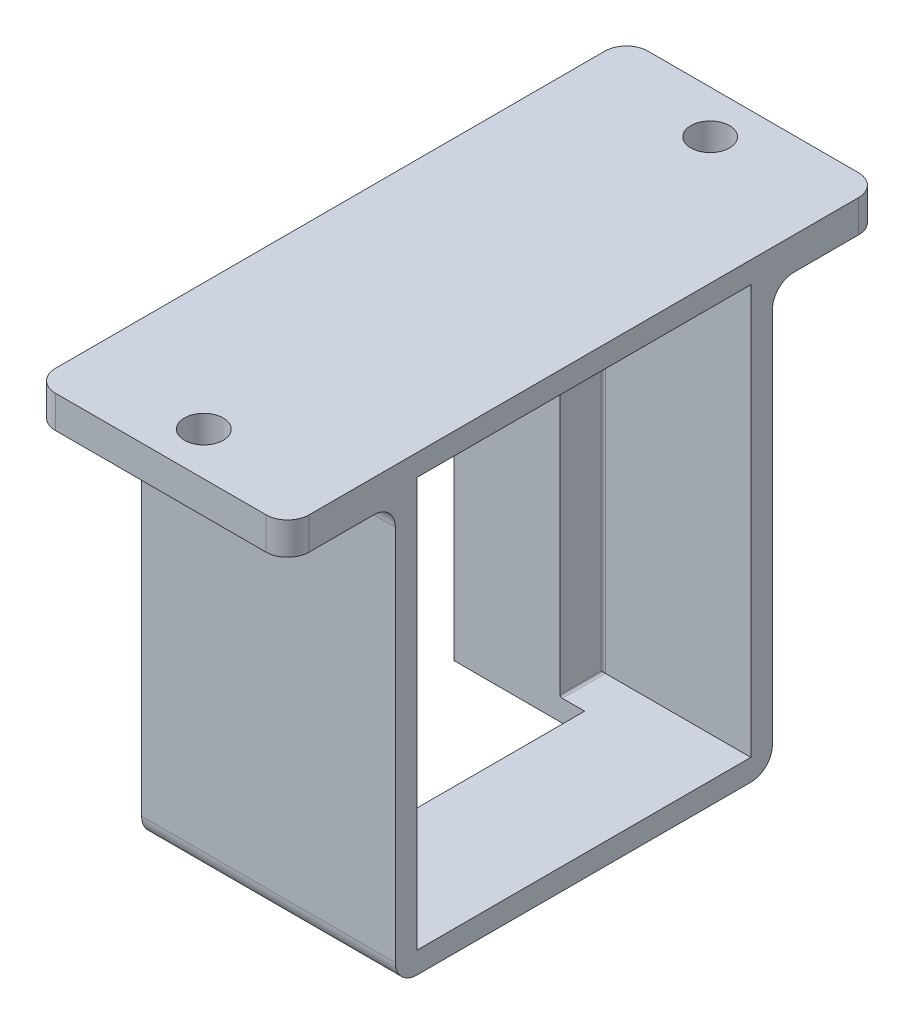
ISO-10303-21;
HEADER;
FILE_DESCRIPTION(('STEP AP214'),'2;1');
FILE_NAME('part.step','',(''),(''),'','','');
FILE_SCHEMA(('AUTOMOTIVE_DESIGN { 1 0 10303 214 1 1 1 1 }'));
ENDSEC;
DATA;
#1=APPLICATION_CONTEXT('core data for automotive mechanical design processes');
#2=APPLICATION_PROTOCOL_DEFINITION('international standard','automotive_design',2000,#1);
#3=PRODUCT_CONTEXT('',#1,'mechanical');
#4=PRODUCT('Part','Part','',(#3));
#5=PRODUCT_RELATED_PRODUCT_CATEGORY('part','',(#4));
#6=PRODUCT_DEFINITION_FORMATION('','',#4);
#7=PRODUCT_DEFINITION_CONTEXT('part definition',#1,'design');
#8=PRODUCT_DEFINITION('design','',#6,#7);
#9=PRODUCT_DEFINITION_SHAPE('','',#8);
#10=(LENGTH_UNIT() NAMED_UNIT(*) SI_UNIT(.MILLI.,.METRE.));
#11=(NAMED_UNIT(*) PLANE_ANGLE_UNIT() SI_UNIT($,.RADIAN.));
#12=(NAMED_UNIT(*) SI_UNIT($,.STERADIAN.) SOLID_ANGLE_UNIT());
#13=UNCERTAINTY_MEASURE_WITH_UNIT(LENGTH_MEASURE(1.E-05),#10,'distance_accuracy_value','');
#14=(GEOMETRIC_REPRESENTATION_CONTEXT(3) GLOBAL_UNCERTAINTY_ASSIGNED_CONTEXT((#13)) GLOBAL_UNIT_ASSIGNED_CONTEXT((#10,
#11,#12)) REPRESENTATION_CONTEXT('',''));
#15=CARTESIAN_POINT('',(0.,0.,0.));
#16=DIRECTION('',(0.,0.,1.));
#17=DIRECTION('',(1.,0.,0.));
#18=AXIS2_PLACEMENT_3D('',#15,#16,#17);
#19=CARTESIAN_POINT('',(106.2,-1.72624809327456,0.));
#20=DIRECTION('',(0.,0.,1.));
#21=DIRECTION('',(1.,0.,0.));
#22=AXIS2_PLACEMENT_3D('',#19,#20,#21);
#23=CYLINDRICAL_SURFACE('',#22,0.2);
#24=DIRECTION('',(0.,0.,-1.));
#25=VECTOR('',#24,1.);
#26=CARTESIAN_POINT('',(106.2,-1.92624809327456,-109.5));
#27=LINE('',#26,#25);
#28=CARTESIAN_POINT('',(106.2,-1.92624809327456,-113.5));
#29=VERTEX_POINT('',#28);
#30=CARTESIAN_POINT('',(106.2,-1.92624809327456,-109.5));
#31=VERTEX_POINT('',#30);
#32=EDGE_CURVE('E371',#29,#31,#27,.F.);
#33=ORIENTED_EDGE('',*,*,#32,.F.);
#34=CARTESIAN_POINT('',(106.2,-1.72624809327456,-113.5));
#35=DIRECTION('',(0.,0.,1.));
#36=DIRECTION('',(0.,-1.,0.));
#37=AXIS2_PLACEMENT_3D('',#34,#35,#36);
#38=CIRCLE('',#37,0.2);
#39=CARTESIAN_POINT('',(106.,-1.72624809327456,-113.5));
#40=VERTEX_POINT('',#39);
#41=EDGE_CURVE('E576',#29,#40,#38,.F.);
#42=ORIENTED_EDGE('',*,*,#41,.T.);
#43=DIRECTION('',(0.,0.,-1.));
#44=VECTOR('',#43,1.);
#45=CARTESIAN_POINT('',(106.,-1.72624809327456,-140.5));
#46=LINE('',#45,#44);
#47=CARTESIAN_POINT('',(106.,-1.72624809327456,-109.7));
#48=VERTEX_POINT('',#47);
#49=EDGE_CURVE('E352',#48,#40,#46,.T.);
#50=ORIENTED_EDGE('',*,*,#49,.F.);
#51=CARTESIAN_POINT('',(106.2,-1.72624809327456,-109.7));
#52=DIRECTION('',(0.,0.707106781186547,0.707106781186548));
#53=DIRECTION('',(0.,-0.707106781186548,0.707106781186547));
#54=AXIS2_PLACEMENT_3D('',#51,#52,#53);
#55=ELLIPSE('',#54,0.282842712474619,0.2);
#56=EDGE_CURVE('E385',#31,#48,#55,.F.);
#57=ORIENTED_EDGE('',*,*,#56,.F.);
#58=EDGE_LOOP('',(#33,#42,#50,#57));
#59=FACE_BOUND('',#58,.T.);
#60=ADVANCED_FACE('F49',(#59),#23,.F.);
#61=CARTESIAN_POINT('',(107.981937187953,38.0737519067254,-111.5));
#62=DIRECTION('',(0.,1.,0.));
#63=DIRECTION('',(-1.,0.,0.));
#64=AXIS2_PLACEMENT_3D('',#61,#62,#63);
#65=PLANE('',#64);
#66=DIRECTION('',(1.,0.,0.));
#67=VECTOR('',#66,1.);
#68=CARTESIAN_POINT('',(96.1491129061229,38.0737519067254,-97.5000000000001));
#69=LINE('',#68,#67);
#70=CARTESIAN_POINT('',(98.1491129061229,38.0737519067254,-97.5000000000001));
#71=VERTEX_POINT('',#70);
#72=CARTESIAN_POINT('',(117.7,38.0737519067254,-97.5000000000001));
#73=VERTEX_POINT('',#72);
#74=EDGE_CURVE('E599',#71,#73,#69,.T.);
#75=ORIENTED_EDGE('',*,*,#74,.T.);
#76=CARTESIAN_POINT('',(117.7,38.0737519067254,-99.5000000000001));
#77=DIRECTION('',(0.,1.,0.));
#78=DIRECTION('',(-1.,0.,0.));
#79=AXIS2_PLACEMENT_3D('',#76,#77,#78);
#80=CIRCLE('',#79,2.);
#81=CARTESIAN_POINT('',(119.7,38.0737519067254,-99.5000000000001));
#82=VERTEX_POINT('',#81);
#83=EDGE_CURVE('E508',#73,#82,#80,.T.);
#84=ORIENTED_EDGE('',*,*,#83,.T.);
#85=DIRECTION('',(0.,0.,1.));
#86=VECTOR('',#85,1.);
#87=CARTESIAN_POINT('',(119.7,38.0737519067254,-113.5));
#88=LINE('',#87,#86);
#89=CARTESIAN_POINT('',(119.7,38.0737519067254,-150.5));
#90=VERTEX_POINT('',#89);
#91=EDGE_CURVE('E334',#90,#82,#88,.T.);
#92=ORIENTED_EDGE('',*,*,#91,.F.);
#93=CARTESIAN_POINT('',(117.7,38.0737519067254,-150.5));
#94=DIRECTION('',(0.,1.,0.));
#95=DIRECTION('',(-1.,0.,0.));
#96=AXIS2_PLACEMENT_3D('',#93,#94,#95);
#97=CIRCLE('',#96,2.);
#98=CARTESIAN_POINT('',(117.7,38.0737519067254,-152.5));
#99=VERTEX_POINT('',#98);
#100=EDGE_CURVE('E71',#90,#99,#97,.T.);
#101=ORIENTED_EDGE('',*,*,#100,.T.);
#102=DIRECTION('',(1.,0.,0.));
#103=VECTOR('',#102,1.);
#104=CARTESIAN_POINT('',(96.1491129061229,38.0737519067254,-152.5));
#105=LINE('',#104,#103);
#106=CARTESIAN_POINT('',(98.1491129061229,38.0737519067254,-152.5));
#107=VERTEX_POINT('',#106);
#108=EDGE_CURVE('E515',#107,#99,#105,.T.);
#109=ORIENTED_EDGE('',*,*,#108,.F.);
#110=CARTESIAN_POINT('',(98.1491129061229,38.0737519067254,-150.5));
#111=DIRECTION('',(0.,1.,0.));
#112=DIRECTION('',(-1.,0.,0.));
#113=AXIS2_PLACEMENT_3D('',#110,#111,#112);
#114=CIRCLE('',#113,2.);
#115=CARTESIAN_POINT('',(96.1491129061229,38.0737519067254,-150.5));
#116=VERTEX_POINT('',#115);
#117=EDGE_CURVE('E472',#107,#116,#114,.T.);
#118=ORIENTED_EDGE('',*,*,#117,.T.);
#119=DIRECTION('',(0.,0.,1.));
#120=VECTOR('',#119,1.);
#121=CARTESIAN_POINT('',(96.1491129061229,38.0737519067254,-101.));
#122=LINE('',#121,#120);
#123=CARTESIAN_POINT('',(96.1491129061229,38.0737519067254,-99.5000000000001));
#124=VERTEX_POINT('',#123);
#125=EDGE_CURVE('E289',#116,#124,#122,.T.);
#126=ORIENTED_EDGE('',*,*,#125,.T.);
#127=CARTESIAN_POINT('',(98.1491129061229,38.0737519067254,-99.5000000000001));
#128=DIRECTION('',(0.,1.,0.));
#129=DIRECTION('',(-1.,0.,0.));
#130=AXIS2_PLACEMENT_3D('',#127,#128,#129);
#131=CIRCLE('',#130,2.);
#132=EDGE_CURVE('E469',#124,#71,#131,.T.);
#133=ORIENTED_EDGE('',*,*,#132,.T.);
#134=EDGE_LOOP('',(#75,#84,#92,#101,#109,#118,#126,#133));
#135=FACE_BOUND('',#134,.T.);
#136=CARTESIAN_POINT('',(107.924556453061,38.0737519067254,-101.5));
#137=DIRECTION('',(0.,1.,0.));
#138=DIRECTION('',(-1.,0.,0.));
#139=AXIS2_PLACEMENT_3D('',#136,#137,#138);
#140=CIRCLE('',#139,1.79999999999999);
#141=CARTESIAN_POINT('',(106.124556453061,38.0737519067254,-101.5));
#142=VERTEX_POINT('',#141);
#143=EDGE_CURVE('E585',#142,#142,#140,.T.);
#144=ORIENTED_EDGE('',*,*,#143,.F.);
#145=EDGE_LOOP('',(#144));
#146=FACE_BOUND('',#145,.T.);
#147=CARTESIAN_POINT('',(107.924556453061,38.0737519067254,-148.5));
#148=DIRECTION('',(0.,1.,0.));
#149=DIRECTION('',(-1.,0.,0.));
#150=AXIS2_PLACEMENT_3D('',#147,#148,#149);
#151=CIRCLE('',#150,1.79999999999999);
#152=CARTESIAN_POINT('',(106.124556453061,38.0737519067254,-148.5));
#153=VERTEX_POINT('',#152);
#154=EDGE_CURVE('E592',#153,#153,#151,.F.);
#155=ORIENTED_EDGE('',*,*,#154,.T.);
#156=EDGE_LOOP('',(#155));
#157=FACE_BOUND('',#156,.T.);
#158=ADVANCED_FACE('F626',(#135,#146,#157),#65,.T.);
#159=CARTESIAN_POINT('',(107.981937187953,34.0737519067254,-142.5));
#160=DIRECTION('',(0.,0.,-1.));
#161=DIRECTION('',(0.,1.,0.));
#162=AXIS2_PLACEMENT_3D('',#159,#160,#161);
#163=PLANE('',#162);
#164=DIRECTION('',(0.,1.,0.));
#165=VECTOR('',#164,1.);
#166=CARTESIAN_POINT('',(96.1491129061229,42.2892933169066,-142.5));
#167=LINE('',#166,#165);
#168=CARTESIAN_POINT('',(96.1491129061228,-1.92624809327456,-142.5));
#169=VERTEX_POINT('',#168);
#170=CARTESIAN_POINT('',(96.1491129061228,33.0737519067254,-142.5));
#171=VERTEX_POINT('',#170);
#172=EDGE_CURVE('E293',#169,#171,#167,.T.);
#173=ORIENTED_EDGE('',*,*,#172,.T.);
#174=DIRECTION('',(-1.,0.,0.));
#175=VECTOR('',#174,1.);
#176=CARTESIAN_POINT('',(107.981937187953,33.0737519067254,-142.5));
#177=LINE('',#176,#175);
#178=CARTESIAN_POINT('',(119.7,33.0737519067254,-142.5));
#179=VERTEX_POINT('',#178);
#180=EDGE_CURVE('E438',#171,#179,#177,.F.);
#181=ORIENTED_EDGE('',*,*,#180,.T.);
#182=DIRECTION('',(0.,1.,0.));
#183=VECTOR('',#182,1.);
#184=CARTESIAN_POINT('',(119.7,32.0737519067254,-142.5));
#185=LINE('',#184,#183);
#186=CARTESIAN_POINT('',(119.7,-1.92624809327456,-142.5));
#187=VERTEX_POINT('',#186);
#188=EDGE_CURVE('E330',#187,#179,#185,.T.);
#189=ORIENTED_EDGE('',*,*,#188,.F.);
#190=DIRECTION('',(1.,0.,0.));
#191=VECTOR('',#190,1.);
#192=CARTESIAN_POINT('',(96.1491129061228,-1.92624809327456,-142.5));
#193=LINE('',#192,#191);
#194=EDGE_CURVE('E413',#187,#169,#193,.F.);
#195=ORIENTED_EDGE('',*,*,#194,.T.);
#196=EDGE_LOOP('',(#173,#181,#189,#195));
#197=FACE_BOUND('',#196,.T.);
#198=ADVANCED_FACE('F542',(#197),#163,.T.);
#199=CARTESIAN_POINT('',(119.7,34.0737519067254,-107.5));
#200=DIRECTION('',(0.,0.,1.));
#201=DIRECTION('',(0.,-1.,0.));
#202=AXIS2_PLACEMENT_3D('',#199,#200,#201);
#203=PLANE('',#202);
#204=DIRECTION('',(0.,-1.,0.));
#205=VECTOR('',#204,1.);
#206=CARTESIAN_POINT('',(119.7,32.0737519067254,-107.5));
#207=LINE('',#206,#205);
#208=CARTESIAN_POINT('',(119.7,33.0737519067254,-107.5));
#209=VERTEX_POINT('',#208);
#210=CARTESIAN_POINT('',(119.7,-1.92624809327457,-107.5));
#211=VERTEX_POINT('',#210);
#212=EDGE_CURVE('E327',#209,#211,#207,.T.);
#213=ORIENTED_EDGE('',*,*,#212,.F.);
#214=DIRECTION('',(-1.,0.,0.));
#215=VECTOR('',#214,1.);
#216=CARTESIAN_POINT('',(96.1491129061229,33.0737519067254,-107.5));
#217=LINE('',#216,#215);
#218=CARTESIAN_POINT('',(96.1491129061228,33.0737519067254,-107.5));
#219=VERTEX_POINT('',#218);
#220=EDGE_CURVE('E426',#209,#219,#217,.T.);
#221=ORIENTED_EDGE('',*,*,#220,.T.);
#222=DIRECTION('',(0.,-1.,0.));
#223=VECTOR('',#222,1.);
#224=CARTESIAN_POINT('',(96.1491129061229,42.2892933169067,-107.5));
#225=LINE('',#224,#223);
#226=CARTESIAN_POINT('',(96.1491129061228,-1.92624809327457,-107.5));
#227=VERTEX_POINT('',#226);
#228=EDGE_CURVE('E395',#219,#227,#225,.T.);
#229=ORIENTED_EDGE('',*,*,#228,.T.);
#230=DIRECTION('',(1.,0.,0.));
#231=VECTOR('',#230,1.);
#232=CARTESIAN_POINT('',(119.7,-1.92624809327457,-107.5));
#233=LINE('',#232,#231);
#234=EDGE_CURVE('E422',#227,#211,#233,.T.);
#235=ORIENTED_EDGE('',*,*,#234,.T.);
#236=EDGE_LOOP('',(#213,#221,#229,#235));
#237=FACE_BOUND('',#236,.T.);
#238=ADVANCED_FACE('F555',(#237),#203,.T.);
#239=CARTESIAN_POINT('',(105.64252224468,-3.92624809327456,-145.738640408124));
#240=DIRECTION('',(0.,1.,0.));
#241=DIRECTION('',(0.,0.,1.));
#242=AXIS2_PLACEMENT_3D('',#239,#240,#241);
#243=PLANE('',#242);
#244=DIRECTION('',(0.,0.,1.));
#245=VECTOR('',#244,1.);
#246=CARTESIAN_POINT('',(96.1491129061229,-3.92624809327456,-107.500000000016));
#247=LINE('',#246,#245);
#248=CARTESIAN_POINT('',(96.1491129061229,-3.92624809327456,-113.5));
#249=VERTEX_POINT('',#248);
#250=CARTESIAN_POINT('',(96.1491129061229,-3.92624809327456,-109.5));
#251=VERTEX_POINT('',#250);
#252=EDGE_CURVE('E276',#249,#251,#247,.T.);
#253=ORIENTED_EDGE('',*,*,#252,.F.);
#254=DIRECTION('',(-1.,0.,0.));
#255=VECTOR('',#254,1.);
#256=CARTESIAN_POINT('',(96.1491129061229,-3.92624809327456,-113.5));
#257=LINE('',#256,#255);
#258=CARTESIAN_POINT('',(108.273016103018,-3.92624809327456,-113.5));
#259=VERTEX_POINT('',#258);
#260=EDGE_CURVE('E559',#259,#249,#257,.T.);
#261=ORIENTED_EDGE('',*,*,#260,.F.);
#262=DIRECTION('',(0.,0.,1.));
#263=VECTOR('',#262,1.);
#264=CARTESIAN_POINT('',(108.273016103018,-3.92624809327456,-136.5));
#265=LINE('',#264,#263);
#266=CARTESIAN_POINT('',(108.273016103018,-3.92624809327456,-136.5));
#267=VERTEX_POINT('',#266);
#268=EDGE_CURVE('E266',#267,#259,#265,.T.);
#269=ORIENTED_EDGE('',*,*,#268,.F.);
#270=DIRECTION('',(1.,0.,0.));
#271=VECTOR('',#270,1.);
#272=CARTESIAN_POINT('',(96.1491129061229,-3.92624809327456,-136.5));
#273=LINE('',#272,#271);
#274=CARTESIAN_POINT('',(96.1491129061229,-3.92624809327456,-136.5));
#275=VERTEX_POINT('',#274);
#276=EDGE_CURVE('E245',#275,#267,#273,.T.);
#277=ORIENTED_EDGE('',*,*,#276,.F.);
#278=CARTESIAN_POINT('',(96.1491129061229,-3.92624809327456,-140.5));
#279=VERTEX_POINT('',#278);
#280=EDGE_CURVE('E262',#279,#275,#247,.T.);
#281=ORIENTED_EDGE('',*,*,#280,.F.);
#282=DIRECTION('',(1.,0.,0.));
#283=VECTOR('',#282,1.);
#284=CARTESIAN_POINT('',(119.7,-3.92624809327456,-140.5));
#285=LINE('',#284,#283);
#286=CARTESIAN_POINT('',(119.7,-3.92624809327456,-140.5));
#287=VERTEX_POINT('',#286);
#288=EDGE_CURVE('E404',#279,#287,#285,.T.);
#289=ORIENTED_EDGE('',*,*,#288,.T.);
#290=DIRECTION('',(0.,0.,-1.));
#291=VECTOR('',#290,1.);
#292=CARTESIAN_POINT('',(119.7,-3.92624809327456,-107.5));
#293=LINE('',#292,#291);
#294=CARTESIAN_POINT('',(119.7,-3.92624809327456,-109.5));
#295=VERTEX_POINT('',#294);
#296=EDGE_CURVE('E275',#295,#287,#293,.T.);
#297=ORIENTED_EDGE('',*,*,#296,.F.);
#298=DIRECTION('',(1.,0.,0.));
#299=VECTOR('',#298,1.);
#300=CARTESIAN_POINT('',(96.1491129061228,-3.92624809327456,-109.5));
#301=LINE('',#300,#299);
#302=EDGE_CURVE('E379',#295,#251,#301,.F.);
#303=ORIENTED_EDGE('',*,*,#302,.T.);
#304=EDGE_LOOP('',(#253,#261,#269,#277,#281,#289,#297,#303));
#305=FACE_BOUND('',#304,.T.);
#306=ADVANCED_FACE('F260',(#305),#243,.F.);
#307=CARTESIAN_POINT('',(106.,0.,0.));
#308=DIRECTION('',(1.,0.,0.));
#309=DIRECTION('',(0.,0.,-1.));
#310=AXIS2_PLACEMENT_3D('',#307,#308,#309);
#311=PLANE('',#310);
#312=ORIENTED_EDGE('',*,*,#49,.T.);
#313=DIRECTION('',(0.,-1.,0.));
#314=VECTOR('',#313,1.);
#315=CARTESIAN_POINT('',(106.,32.0737519067254,-113.5));
#316=LINE('',#315,#314);
#317=CARTESIAN_POINT('',(106.,32.0737519067254,-113.5));
#318=VERTEX_POINT('',#317);
#319=EDGE_CURVE('E301',#318,#40,#316,.T.);
#320=ORIENTED_EDGE('',*,*,#319,.F.);
#321=DIRECTION('',(0.,0.,1.));
#322=VECTOR('',#321,1.);
#323=CARTESIAN_POINT('',(106.,32.0737519067254,-113.5));
#324=LINE('',#323,#322);
#325=CARTESIAN_POINT('',(106.,32.0737519067254,-136.5));
#326=VERTEX_POINT('',#325);
#327=EDGE_CURVE('E308',#326,#318,#324,.T.);
#328=ORIENTED_EDGE('',*,*,#327,.F.);
#329=DIRECTION('',(0.,1.,0.));
#330=VECTOR('',#329,1.);
#331=CARTESIAN_POINT('',(106.,32.0737519067254,-136.5));
#332=LINE('',#331,#330);
#333=CARTESIAN_POINT('',(106.,-1.72624809327456,-136.5));
#334=VERTEX_POINT('',#333);
#335=EDGE_CURVE('E304',#334,#326,#332,.T.);
#336=ORIENTED_EDGE('',*,*,#335,.F.);
#337=CARTESIAN_POINT('',(106.,-1.72624809327456,-140.3));
#338=VERTEX_POINT('',#337);
#339=EDGE_CURVE('E351',#334,#338,#46,.T.);
#340=ORIENTED_EDGE('',*,*,#339,.T.);
#341=DIRECTION('',(0.,1.,0.));
#342=VECTOR('',#341,1.);
#343=CARTESIAN_POINT('',(106.,36.0737519067254,-140.3));
#344=LINE('',#343,#342);
#345=CARTESIAN_POINT('',(106.,35.8737519067254,-140.3));
#346=VERTEX_POINT('',#345);
#347=EDGE_CURVE('E356',#338,#346,#344,.T.);
#348=ORIENTED_EDGE('',*,*,#347,.T.);
#349=DIRECTION('',(0.,0.,1.));
#350=VECTOR('',#349,1.);
#351=CARTESIAN_POINT('',(106.,35.8737519067254,-109.5));
#352=LINE('',#351,#350);
#353=CARTESIAN_POINT('',(106.,35.8737519067254,-109.7));
#354=VERTEX_POINT('',#353);
#355=EDGE_CURVE('E359',#346,#354,#352,.T.);
#356=ORIENTED_EDGE('',*,*,#355,.T.);
#357=DIRECTION('',(0.,-1.,0.));
#358=VECTOR('',#357,1.);
#359=CARTESIAN_POINT('',(106.,-1.92624809327456,-109.7));
#360=LINE('',#359,#358);
#361=EDGE_CURVE('E348',#354,#48,#360,.T.);
#362=ORIENTED_EDGE('',*,*,#361,.T.);
#363=EDGE_LOOP('',(#312,#320,#328,#336,#340,#348,#356,#362));
#364=FACE_BOUND('',#363,.T.);
#365=ADVANCED_FACE('F692',(#364),#311,.T.);
#366=CARTESIAN_POINT('',(85.,32.0737519067254,-113.5));
#367=DIRECTION('',(0.,1.,0.));
#368=DIRECTION('',(-1.,0.,0.));
#369=AXIS2_PLACEMENT_3D('',#366,#367,#368);
#370=PLANE('',#369);
#371=DIRECTION('',(1.,0.,0.));
#372=VECTOR('',#371,1.);
#373=CARTESIAN_POINT('',(85.,32.0737519067254,-136.5));
#374=LINE('',#373,#372);
#375=CARTESIAN_POINT('',(96.1491129061228,32.0737519067254,-136.5));
#376=VERTEX_POINT('',#375);
#377=EDGE_CURVE('E248',#376,#326,#374,.T.);
#378=ORIENTED_EDGE('',*,*,#377,.T.);
#379=ORIENTED_EDGE('',*,*,#327,.T.);
#380=DIRECTION('',(1.,0.,0.));
#381=VECTOR('',#380,1.);
#382=CARTESIAN_POINT('',(85.,32.0737519067254,-113.5));
#383=LINE('',#382,#381);
#384=CARTESIAN_POINT('',(96.1491129061228,32.0737519067254,-113.5));
#385=VERTEX_POINT('',#384);
#386=EDGE_CURVE('E255',#385,#318,#383,.T.);
#387=ORIENTED_EDGE('',*,*,#386,.F.);
#388=DIRECTION('',(0.,0.,1.));
#389=VECTOR('',#388,1.);
#390=CARTESIAN_POINT('',(96.1491129061228,32.0737519067254,-101.));
#391=LINE('',#390,#389);
#392=EDGE_CURVE('E297',#376,#385,#391,.T.);
#393=ORIENTED_EDGE('',*,*,#392,.F.);
#394=EDGE_LOOP('',(#378,#379,#387,#393));
#395=FACE_BOUND('',#394,.T.);
#396=ADVANCED_FACE('F697',(#395),#370,.F.);
#397=CARTESIAN_POINT('',(85.,32.0737519067254,-136.5));
#398=DIRECTION('',(0.,0.,-1.));
#399=DIRECTION('',(0.,1.,0.));
#400=AXIS2_PLACEMENT_3D('',#397,#398,#399);
#401=PLANE('',#400);
#402=DIRECTION('',(0.,1.,0.));
#403=VECTOR('',#402,1.);
#404=CARTESIAN_POINT('',(96.1491129061229,42.2892933169066,-136.5));
#405=LINE('',#404,#403);
#406=EDGE_CURVE('E242',#275,#376,#405,.T.);
#407=ORIENTED_EDGE('',*,*,#406,.F.);
#408=ORIENTED_EDGE('',*,*,#276,.T.);
#409=DIRECTION('',(0.,-1.,0.));
#410=VECTOR('',#409,1.);
#411=CARTESIAN_POINT('',(108.273016103018,2.07375190672545,-136.5));
#412=LINE('',#411,#410);
#413=CARTESIAN_POINT('',(108.273016103018,-1.92624809327456,-136.5));
#414=VERTEX_POINT('',#413);
#415=EDGE_CURVE('E562',#414,#267,#412,.T.);
#416=ORIENTED_EDGE('',*,*,#415,.F.);
#417=DIRECTION('',(-1.,0.,0.));
#418=VECTOR('',#417,1.);
#419=CARTESIAN_POINT('',(144.,-1.92624809327456,-136.5));
#420=LINE('',#419,#418);
#421=CARTESIAN_POINT('',(106.2,-1.92624809327456,-136.5));
#422=VERTEX_POINT('',#421);
#423=EDGE_CURVE('E455',#414,#422,#420,.T.);
#424=ORIENTED_EDGE('',*,*,#423,.T.);
#425=CARTESIAN_POINT('',(106.2,-1.72624809327456,-136.5));
#426=DIRECTION('',(0.,0.,-1.));
#427=DIRECTION('',(0.,1.,0.));
#428=AXIS2_PLACEMENT_3D('',#425,#426,#427);
#429=CIRCLE('',#428,0.2);
#430=EDGE_CURVE('E571',#334,#422,#429,.F.);
#431=ORIENTED_EDGE('',*,*,#430,.F.);
#432=ORIENTED_EDGE('',*,*,#335,.T.);
#433=ORIENTED_EDGE('',*,*,#377,.F.);
#434=EDGE_LOOP('',(#407,#408,#416,#424,#431,#432,#433));
#435=FACE_BOUND('',#434,.T.);
#436=ADVANCED_FACE('F244',(#435),#401,.F.);
#437=CARTESIAN_POINT('',(85.,32.0737519067254,-113.5));
#438=DIRECTION('',(0.,0.,1.));
#439=DIRECTION('',(0.,-1.,0.));
#440=AXIS2_PLACEMENT_3D('',#437,#438,#439);
#441=PLANE('',#440);
#442=ORIENTED_EDGE('',*,*,#319,.T.);
#443=ORIENTED_EDGE('',*,*,#41,.F.);
#444=DIRECTION('',(1.,0.,0.));
#445=VECTOR('',#444,1.);
#446=CARTESIAN_POINT('',(144.,-1.92624809327456,-113.5));
#447=LINE('',#446,#445);
#448=CARTESIAN_POINT('',(108.273016103018,-1.92624809327456,-113.5));
#449=VERTEX_POINT('',#448);
#450=EDGE_CURVE('E462',#29,#449,#447,.T.);
#451=ORIENTED_EDGE('',*,*,#450,.T.);
#452=DIRECTION('',(0.,-1.,0.));
#453=VECTOR('',#452,1.);
#454=CARTESIAN_POINT('',(108.273016103018,2.07375190672544,-113.5));
#455=LINE('',#454,#453);
#456=EDGE_CURVE('E566',#449,#259,#455,.T.);
#457=ORIENTED_EDGE('',*,*,#456,.T.);
#458=ORIENTED_EDGE('',*,*,#260,.T.);
#459=DIRECTION('',(0.,-1.,0.));
#460=VECTOR('',#459,1.);
#461=CARTESIAN_POINT('',(96.1491129061229,42.2892933169067,-113.5));
#462=LINE('',#461,#460);
#463=EDGE_CURVE('E254',#385,#249,#462,.T.);
#464=ORIENTED_EDGE('',*,*,#463,.F.);
#465=ORIENTED_EDGE('',*,*,#386,.T.);
#466=EDGE_LOOP('',(#442,#443,#451,#457,#458,#464,#465));
#467=FACE_BOUND('',#466,.T.);
#468=ADVANCED_FACE('F698',(#467),#441,.F.);
#469=CARTESIAN_POINT('',(96.1491129061229,42.2892933169067,-101.));
#470=DIRECTION('',(1.,0.,0.));
#471=DIRECTION('',(0.,1.,0.));
#472=AXIS2_PLACEMENT_3D('',#469,#470,#471);
#473=PLANE('',#472);
#474=ORIENTED_EDGE('',*,*,#125,.F.);
#475=DIRECTION('',(0.,1.,0.));
#476=VECTOR('',#475,1.);
#477=CARTESIAN_POINT('',(96.1491129061229,42.2892933169067,-150.5));
#478=LINE('',#477,#476);
#479=CARTESIAN_POINT('',(96.1491129061229,35.0737519067254,-150.5));
#480=VERTEX_POINT('',#479);
#481=EDGE_CURVE('E479',#116,#480,#478,.F.);
#482=ORIENTED_EDGE('',*,*,#481,.T.);
#483=DIRECTION('',(0.,0.,1.));
#484=VECTOR('',#483,1.);
#485=CARTESIAN_POINT('',(96.1491129061229,35.0737519067254,-152.5));
#486=LINE('',#485,#484);
#487=CARTESIAN_POINT('',(96.1491129061229,35.0737519067254,-144.5));
#488=VERTEX_POINT('',#487);
#489=EDGE_CURVE('E523',#480,#488,#486,.T.);
#490=ORIENTED_EDGE('',*,*,#489,.T.);
#491=CARTESIAN_POINT('',(96.1491129061228,33.0737519067254,-144.5));
#492=DIRECTION('',(1.,0.,0.));
#493=DIRECTION('',(0.,1.,0.));
#494=AXIS2_PLACEMENT_3D('',#491,#492,#493);
#495=CIRCLE('',#494,2.);
#496=EDGE_CURVE('E448',#488,#171,#495,.T.);
#497=ORIENTED_EDGE('',*,*,#496,.T.);
#498=ORIENTED_EDGE('',*,*,#172,.F.);
#499=CARTESIAN_POINT('',(96.1491129061228,-1.92624809327456,-140.5));
#500=DIRECTION('',(1.,0.,0.));
#501=DIRECTION('',(0.,1.,0.));
#502=AXIS2_PLACEMENT_3D('',#499,#500,#501);
#503=CIRCLE('',#502,2.);
#504=EDGE_CURVE('E273',#169,#279,#503,.F.);
#505=ORIENTED_EDGE('',*,*,#504,.T.);
#506=ORIENTED_EDGE('',*,*,#280,.T.);
#507=ORIENTED_EDGE('',*,*,#406,.T.);
#508=ORIENTED_EDGE('',*,*,#392,.T.);
#509=ORIENTED_EDGE('',*,*,#463,.T.);
#510=ORIENTED_EDGE('',*,*,#252,.T.);
#511=CARTESIAN_POINT('',(96.1491129061228,-1.92624809327457,-109.5));
#512=DIRECTION('',(1.,0.,0.));
#513=DIRECTION('',(0.,1.,0.));
#514=AXIS2_PLACEMENT_3D('',#511,#512,#513);
#515=CIRCLE('',#514,2.);
#516=EDGE_CURVE('E416',#251,#227,#515,.F.);
#517=ORIENTED_EDGE('',*,*,#516,.T.);
#518=ORIENTED_EDGE('',*,*,#228,.F.);
#519=CARTESIAN_POINT('',(96.1491129061229,33.0737519067254,-105.5));
#520=DIRECTION('',(1.,0.,0.));
#521=DIRECTION('',(0.,1.,0.));
#522=AXIS2_PLACEMENT_3D('',#519,#520,#521);
#523=CIRCLE('',#522,2.);
#524=CARTESIAN_POINT('',(96.1491129061229,35.0737519067255,-105.5));
#525=VERTEX_POINT('',#524);
#526=EDGE_CURVE('E441',#219,#525,#523,.T.);
#527=ORIENTED_EDGE('',*,*,#526,.T.);
#528=DIRECTION('',(0.,0.,-1.));
#529=VECTOR('',#528,1.);
#530=CARTESIAN_POINT('',(96.1491129061229,35.0737519067254,-97.5000000000001));
#531=LINE('',#530,#529);
#532=CARTESIAN_POINT('',(96.1491129061229,35.0737519067254,-99.5000000000001));
#533=VERTEX_POINT('',#532);
#534=EDGE_CURVE('E528',#533,#525,#531,.T.);
#535=ORIENTED_EDGE('',*,*,#534,.F.);
#536=DIRECTION('',(0.,1.,0.));
#537=VECTOR('',#536,1.);
#538=CARTESIAN_POINT('',(96.1491129061229,42.2892933169067,-99.5000000000001));
#539=LINE('',#538,#537);
#540=EDGE_CURVE('E475',#533,#124,#539,.T.);
#541=ORIENTED_EDGE('',*,*,#540,.T.);
#542=EDGE_LOOP('',(#474,#482,#490,#497,#498,#505,#506,#507,#508,#509,#510,#517,#518,#527,#535,#541));
#543=FACE_BOUND('',#542,.T.);
#544=ADVANCED_FACE('F270',(#543),#473,.F.);
#545=CARTESIAN_POINT('',(106.2,35.8737519067254,0.));
#546=DIRECTION('',(0.,0.,-1.));
#547=DIRECTION('',(-1.,0.,0.));
#548=AXIS2_PLACEMENT_3D('',#545,#546,#547);
#549=CYLINDRICAL_SURFACE('',#548,0.2);
#550=CARTESIAN_POINT('',(106.2,35.8737519067254,-140.3));
#551=DIRECTION('',(0.,-0.707106781186548,-0.707106781186547));
#552=DIRECTION('',(0.,0.707106781186547,-0.707106781186548));
#553=AXIS2_PLACEMENT_3D('',#550,#551,#552);
#554=ELLIPSE('',#553,0.282842712474619,0.2);
#555=CARTESIAN_POINT('',(106.2,36.0737519067254,-140.5));
#556=VERTEX_POINT('',#555);
#557=EDGE_CURVE('E382',#346,#556,#554,.T.);
#558=ORIENTED_EDGE('',*,*,#557,.T.);
#559=DIRECTION('',(0.,0.,1.));
#560=VECTOR('',#559,1.);
#561=CARTESIAN_POINT('',(106.2,36.0737519067254,-140.5));
#562=LINE('',#561,#560);
#563=CARTESIAN_POINT('',(106.2,36.0737519067254,-109.5));
#564=VERTEX_POINT('',#563);
#565=EDGE_CURVE('E363',#564,#556,#562,.F.);
#566=ORIENTED_EDGE('',*,*,#565,.F.);
#567=CARTESIAN_POINT('',(106.2,35.8737519067254,-109.7));
#568=DIRECTION('',(0.,0.707106781186548,-0.707106781186547));
#569=DIRECTION('',(0.,-0.707106781186547,-0.707106781186548));
#570=AXIS2_PLACEMENT_3D('',#567,#568,#569);
#571=ELLIPSE('',#570,0.282842712474619,0.2);
#572=EDGE_CURVE('E300',#564,#354,#571,.F.);
#573=ORIENTED_EDGE('',*,*,#572,.T.);
#574=ORIENTED_EDGE('',*,*,#355,.F.);
#575=EDGE_LOOP('',(#558,#566,#573,#574));
#576=FACE_BOUND('',#575,.T.);
#577=ADVANCED_FACE('F654',(#576),#549,.F.);
#578=CARTESIAN_POINT('',(106.2,0.,-109.7));
#579=DIRECTION('',(0.,1.,0.));
#580=DIRECTION('',(0.,0.,1.));
#581=AXIS2_PLACEMENT_3D('',#578,#579,#580);
#582=CYLINDRICAL_SURFACE('',#581,0.2);
#583=ORIENTED_EDGE('',*,*,#56,.T.);
#584=ORIENTED_EDGE('',*,*,#361,.F.);
#585=ORIENTED_EDGE('',*,*,#572,.F.);
#586=DIRECTION('',(0.,-1.,0.));
#587=VECTOR('',#586,1.);
#588=CARTESIAN_POINT('',(106.2,36.0737519067254,-109.5));
#589=LINE('',#588,#587);
#590=EDGE_CURVE('E376',#31,#564,#589,.F.);
#591=ORIENTED_EDGE('',*,*,#590,.F.);
#592=EDGE_LOOP('',(#583,#584,#585,#591));
#593=FACE_BOUND('',#592,.T.);
#594=ADVANCED_FACE('F646',(#593),#582,.F.);
#595=ORIENTED_EDGE('',*,*,#339,.F.);
#596=ORIENTED_EDGE('',*,*,#430,.T.);
#597=CARTESIAN_POINT('',(106.2,-1.92624809327456,-140.5));
#598=VERTEX_POINT('',#597);
#599=EDGE_CURVE('E372',#598,#422,#27,.F.);
#600=ORIENTED_EDGE('',*,*,#599,.F.);
#601=CARTESIAN_POINT('',(106.2,-1.72624809327456,-140.3));
#602=DIRECTION('',(0.,-0.707106781186547,0.707106781186548));
#603=DIRECTION('',(0.,-0.707106781186548,-0.707106781186547));
#604=AXIS2_PLACEMENT_3D('',#601,#602,#603);
#605=ELLIPSE('',#604,0.282842712474619,0.2);
#606=EDGE_CURVE('E305',#338,#598,#605,.T.);
#607=ORIENTED_EDGE('',*,*,#606,.F.);
#608=EDGE_LOOP('',(#595,#596,#600,#607));
#609=FACE_BOUND('',#608,.T.);
#610=ADVANCED_FACE('F636',(#609),#23,.F.);
#611=CARTESIAN_POINT('',(106.2,-1.29803575295758E-13,-140.3));
#612=DIRECTION('',(0.,-1.,0.));
#613=DIRECTION('',(0.,0.,-1.));
#614=AXIS2_PLACEMENT_3D('',#611,#612,#613);
#615=CYLINDRICAL_SURFACE('',#614,0.2);
#616=ORIENTED_EDGE('',*,*,#606,.T.);
#617=DIRECTION('',(0.,1.,0.));
#618=VECTOR('',#617,1.);
#619=CARTESIAN_POINT('',(106.2,-1.92624809327456,-140.5));
#620=LINE('',#619,#618);
#621=EDGE_CURVE('E367',#556,#598,#620,.F.);
#622=ORIENTED_EDGE('',*,*,#621,.F.);
#623=ORIENTED_EDGE('',*,*,#557,.F.);
#624=ORIENTED_EDGE('',*,*,#347,.F.);
#625=EDGE_LOOP('',(#616,#622,#623,#624));
#626=FACE_BOUND('',#625,.T.);
#627=ADVANCED_FACE('F645',(#626),#615,.F.);
#628=CARTESIAN_POINT('',(144.,36.0737519067254,-113.5));
#629=DIRECTION('',(0.,-1.,0.));
#630=DIRECTION('',(1.,0.,0.));
#631=AXIS2_PLACEMENT_3D('',#628,#629,#630);
#632=PLANE('',#631);
#633=DIRECTION('',(-1.,0.,0.));
#634=VECTOR('',#633,1.);
#635=CARTESIAN_POINT('',(144.,36.0737519067254,-109.5));
#636=LINE('',#635,#634);
#637=CARTESIAN_POINT('',(119.7,36.0737519067254,-109.5));
#638=VERTEX_POINT('',#637);
#639=EDGE_CURVE('E312',#638,#564,#636,.T.);
#640=ORIENTED_EDGE('',*,*,#639,.T.);
#641=ORIENTED_EDGE('',*,*,#565,.T.);
#642=DIRECTION('',(-1.,0.,0.));
#643=VECTOR('',#642,1.);
#644=CARTESIAN_POINT('',(144.,36.0737519067254,-140.5));
#645=LINE('',#644,#643);
#646=CARTESIAN_POINT('',(119.7,36.0737519067254,-140.5));
#647=VERTEX_POINT('',#646);
#648=EDGE_CURVE('E316',#647,#556,#645,.T.);
#649=ORIENTED_EDGE('',*,*,#648,.F.);
#650=DIRECTION('',(0.,0.,-1.));
#651=VECTOR('',#650,1.);
#652=CARTESIAN_POINT('',(119.7,36.0737519067254,0.));
#653=LINE('',#652,#651);
#654=EDGE_CURVE('E338',#638,#647,#653,.T.);
#655=ORIENTED_EDGE('',*,*,#654,.F.);
#656=EDGE_LOOP('',(#640,#641,#649,#655));
#657=FACE_BOUND('',#656,.T.);
#658=ADVANCED_FACE('F652',(#657),#632,.T.);
#659=CARTESIAN_POINT('',(144.,32.0737519067254,-109.5));
#660=DIRECTION('',(0.,0.,-1.));
#661=DIRECTION('',(0.,1.,0.));
#662=AXIS2_PLACEMENT_3D('',#659,#660,#661);
#663=PLANE('',#662);
#664=DIRECTION('',(0.,1.,0.));
#665=VECTOR('',#664,1.);
#666=CARTESIAN_POINT('',(119.7,0.,-109.5));
#667=LINE('',#666,#665);
#668=CARTESIAN_POINT('',(119.7,-1.92624809327456,-109.5));
#669=VERTEX_POINT('',#668);
#670=EDGE_CURVE('E345',#669,#638,#667,.T.);
#671=ORIENTED_EDGE('',*,*,#670,.F.);
#672=DIRECTION('',(-1.,0.,0.));
#673=VECTOR('',#672,1.);
#674=CARTESIAN_POINT('',(144.,-1.92624809327456,-109.5));
#675=LINE('',#674,#673);
#676=EDGE_CURVE('E323',#669,#31,#675,.T.);
#677=ORIENTED_EDGE('',*,*,#676,.T.);
#678=ORIENTED_EDGE('',*,*,#590,.T.);
#679=ORIENTED_EDGE('',*,*,#639,.F.);
#680=EDGE_LOOP('',(#671,#677,#678,#679));
#681=FACE_BOUND('',#680,.T.);
#682=ADVANCED_FACE('F673',(#681),#663,.T.);
#683=CARTESIAN_POINT('',(144.,-1.92624809327456,-113.5));
#684=DIRECTION('',(0.,1.,0.));
#685=DIRECTION('',(-1.,0.,0.));
#686=AXIS2_PLACEMENT_3D('',#683,#684,#685);
#687=PLANE('',#686);
#688=ORIENTED_EDGE('',*,*,#450,.F.);
#689=ORIENTED_EDGE('',*,*,#32,.T.);
#690=ORIENTED_EDGE('',*,*,#676,.F.);
#691=DIRECTION('',(0.,0.,1.));
#692=VECTOR('',#691,1.);
#693=CARTESIAN_POINT('',(119.7,-1.92624809327456,-113.5));
#694=LINE('',#693,#692);
#695=CARTESIAN_POINT('',(119.7,-1.92624809327455,-140.5));
#696=VERTEX_POINT('',#695);
#697=EDGE_CURVE('E281',#696,#669,#694,.T.);
#698=ORIENTED_EDGE('',*,*,#697,.F.);
#699=DIRECTION('',(-1.,0.,0.));
#700=VECTOR('',#699,1.);
#701=CARTESIAN_POINT('',(144.,-1.92624809327456,-140.5));
#702=LINE('',#701,#700);
#703=EDGE_CURVE('E320',#696,#598,#702,.T.);
#704=ORIENTED_EDGE('',*,*,#703,.T.);
#705=ORIENTED_EDGE('',*,*,#599,.T.);
#706=ORIENTED_EDGE('',*,*,#423,.F.);
#707=DIRECTION('',(0.,0.,-1.));
#708=VECTOR('',#707,1.);
#709=CARTESIAN_POINT('',(108.273016103018,-1.92624809327456,-113.5));
#710=LINE('',#709,#708);
#711=EDGE_CURVE('E458',#449,#414,#710,.T.);
#712=ORIENTED_EDGE('',*,*,#711,.F.);
#713=EDGE_LOOP('',(#688,#689,#690,#698,#704,#705,#706,#712));
#714=FACE_BOUND('',#713,.T.);
#715=ADVANCED_FACE('F668',(#714),#687,.T.);
#716=CARTESIAN_POINT('',(144.,32.0737519067254,-140.5));
#717=DIRECTION('',(0.,0.,1.));
#718=DIRECTION('',(0.,-1.,0.));
#719=AXIS2_PLACEMENT_3D('',#716,#717,#718);
#720=PLANE('',#719);
#721=ORIENTED_EDGE('',*,*,#703,.F.);
#722=DIRECTION('',(0.,-1.,0.));
#723=VECTOR('',#722,1.);
#724=CARTESIAN_POINT('',(119.7,-1.29988612466529E-13,-140.5));
#725=LINE('',#724,#723);
#726=EDGE_CURVE('E342',#647,#696,#725,.T.);
#727=ORIENTED_EDGE('',*,*,#726,.F.);
#728=ORIENTED_EDGE('',*,*,#648,.T.);
#729=ORIENTED_EDGE('',*,*,#621,.T.);
#730=EDGE_LOOP('',(#721,#727,#728,#729));
#731=FACE_BOUND('',#730,.T.);
#732=ADVANCED_FACE('F689',(#731),#720,.T.);
#733=CARTESIAN_POINT('',(119.7,0.,0.));
#734=DIRECTION('',(1.,0.,0.));
#735=DIRECTION('',(0.,0.,-1.));
#736=AXIS2_PLACEMENT_3D('',#733,#734,#735);
#737=PLANE('',#736);
#738=ORIENTED_EDGE('',*,*,#697,.T.);
#739=ORIENTED_EDGE('',*,*,#670,.T.);
#740=ORIENTED_EDGE('',*,*,#654,.T.);
#741=ORIENTED_EDGE('',*,*,#726,.T.);
#742=EDGE_LOOP('',(#738,#739,#740,#741));
#743=FACE_BOUND('',#742,.T.);
#744=ORIENTED_EDGE('',*,*,#91,.T.);
#745=DIRECTION('',(0.,-1.,0.));
#746=VECTOR('',#745,1.);
#747=CARTESIAN_POINT('',(119.7,35.0737519067254,-99.5000000000001));
#748=LINE('',#747,#746);
#749=CARTESIAN_POINT('',(119.7,35.0737519067254,-99.5000000000001));
#750=VERTEX_POINT('',#749);
#751=EDGE_CURVE('E496',#82,#750,#748,.T.);
#752=ORIENTED_EDGE('',*,*,#751,.T.);
#753=DIRECTION('',(0.,0.,-1.));
#754=VECTOR('',#753,1.);
#755=CARTESIAN_POINT('',(119.7,35.0737519067254,-97.5000000000001));
#756=LINE('',#755,#754);
#757=CARTESIAN_POINT('',(119.7,35.0737519067255,-105.5));
#758=VERTEX_POINT('',#757);
#759=EDGE_CURVE('E603',#750,#758,#756,.T.);
#760=ORIENTED_EDGE('',*,*,#759,.T.);
#761=CARTESIAN_POINT('',(119.7,33.0737519067254,-105.5));
#762=DIRECTION('',(1.,0.,0.));
#763=DIRECTION('',(0.,0.,-1.));
#764=AXIS2_PLACEMENT_3D('',#761,#762,#763);
#765=CIRCLE('',#764,2.);
#766=EDGE_CURVE('E445',#758,#209,#765,.F.);
#767=ORIENTED_EDGE('',*,*,#766,.T.);
#768=ORIENTED_EDGE('',*,*,#212,.T.);
#769=CARTESIAN_POINT('',(119.7,-1.92624809327457,-109.5));
#770=DIRECTION('',(1.,0.,0.));
#771=DIRECTION('',(0.,0.,-1.));
#772=AXIS2_PLACEMENT_3D('',#769,#770,#771);
#773=CIRCLE('',#772,2.);
#774=EDGE_CURVE('E407',#211,#295,#773,.T.);
#775=ORIENTED_EDGE('',*,*,#774,.T.);
#776=ORIENTED_EDGE('',*,*,#296,.T.);
#777=CARTESIAN_POINT('',(119.7,-1.92624809327456,-140.5));
#778=DIRECTION('',(1.,0.,0.));
#779=DIRECTION('',(0.,0.,-1.));
#780=AXIS2_PLACEMENT_3D('',#777,#778,#779);
#781=CIRCLE('',#780,2.);
#782=EDGE_CURVE('E410',#287,#187,#781,.T.);
#783=ORIENTED_EDGE('',*,*,#782,.T.);
#784=ORIENTED_EDGE('',*,*,#188,.T.);
#785=CARTESIAN_POINT('',(119.7,33.0737519067254,-144.5));
#786=DIRECTION('',(1.,0.,0.));
#787=DIRECTION('',(0.,0.,-1.));
#788=AXIS2_PLACEMENT_3D('',#785,#786,#787);
#789=CIRCLE('',#788,2.);
#790=CARTESIAN_POINT('',(119.7,35.0737519067254,-144.5));
#791=VERTEX_POINT('',#790);
#792=EDGE_CURVE('E451',#179,#791,#789,.F.);
#793=ORIENTED_EDGE('',*,*,#792,.T.);
#794=DIRECTION('',(0.,0.,1.));
#795=VECTOR('',#794,1.);
#796=CARTESIAN_POINT('',(119.7,35.0737519067254,-152.5));
#797=LINE('',#796,#795);
#798=CARTESIAN_POINT('',(119.7,35.0737519067254,-150.5));
#799=VERTEX_POINT('',#798);
#800=EDGE_CURVE('E283',#799,#791,#797,.T.);
#801=ORIENTED_EDGE('',*,*,#800,.F.);
#802=DIRECTION('',(0.,-1.,0.));
#803=VECTOR('',#802,1.);
#804=CARTESIAN_POINT('',(119.7,38.0737519067254,-150.5));
#805=LINE('',#804,#803);
#806=EDGE_CURVE('E493',#799,#90,#805,.F.);
#807=ORIENTED_EDGE('',*,*,#806,.T.);
#808=EDGE_LOOP('',(#744,#752,#760,#767,#768,#775,#776,#783,#784,#793,#801,#807));
#809=FACE_BOUND('',#808,.T.);
#810=ADVANCED_FACE('F535',(#743,#809),#737,.T.);
#811=CARTESIAN_POINT('',(105.64252224468,-1.92624809327456,-140.5));
#812=DIRECTION('',(-1.,0.,0.));
#813=DIRECTION('',(0.,-1.,0.));
#814=AXIS2_PLACEMENT_3D('',#811,#812,#813);
#815=CYLINDRICAL_SURFACE('',#814,2.);
#816=ORIENTED_EDGE('',*,*,#504,.F.);
#817=ORIENTED_EDGE('',*,*,#194,.F.);
#818=ORIENTED_EDGE('',*,*,#782,.F.);
#819=ORIENTED_EDGE('',*,*,#288,.F.);
#820=EDGE_LOOP('',(#816,#817,#818,#819));
#821=FACE_BOUND('',#820,.T.);
#822=ADVANCED_FACE('F545',(#821),#815,.T.);
#823=CARTESIAN_POINT('',(119.7,-1.92624809327457,-109.5));
#824=DIRECTION('',(-1.,0.,0.));
#825=DIRECTION('',(0.,-1.,0.));
#826=AXIS2_PLACEMENT_3D('',#823,#824,#825);
#827=CYLINDRICAL_SURFACE('',#826,2.);
#828=ORIENTED_EDGE('',*,*,#516,.F.);
#829=ORIENTED_EDGE('',*,*,#302,.F.);
#830=ORIENTED_EDGE('',*,*,#774,.F.);
#831=ORIENTED_EDGE('',*,*,#234,.F.);
#832=EDGE_LOOP('',(#828,#829,#830,#831));
#833=FACE_BOUND('',#832,.T.);
#834=ADVANCED_FACE('F553',(#833),#827,.T.);
#835=CARTESIAN_POINT('',(96.1491129061229,35.0737519067254,-152.5));
#836=DIRECTION('',(0.,1.,0.));
#837=DIRECTION('',(0.,0.,1.));
#838=AXIS2_PLACEMENT_3D('',#835,#836,#837);
#839=PLANE('',#838);
#840=CARTESIAN_POINT('',(107.924556453061,35.0737519067254,-148.5));
#841=DIRECTION('',(0.,-1.,0.));
#842=DIRECTION('',(0.,0.,-1.));
#843=AXIS2_PLACEMENT_3D('',#840,#841,#842);
#844=CIRCLE('',#843,1.79999999999999);
#845=CARTESIAN_POINT('',(107.924556453061,35.0737519067254,-150.3));
#846=VERTEX_POINT('',#845);
#847=EDGE_CURVE('E581',#846,#846,#844,.F.);
#848=ORIENTED_EDGE('',*,*,#847,.T.);
#849=EDGE_LOOP('',(#848));
#850=FACE_BOUND('',#849,.T.);
#851=DIRECTION('',(-1.,0.,0.));
#852=VECTOR('',#851,1.);
#853=CARTESIAN_POINT('',(96.1491129061229,35.0737519067254,-152.5));
#854=LINE('',#853,#852);
#855=CARTESIAN_POINT('',(117.7,35.0737519067254,-152.5));
#856=VERTEX_POINT('',#855);
#857=CARTESIAN_POINT('',(98.1491129061229,35.0737519067254,-152.5));
#858=VERTEX_POINT('',#857);
#859=EDGE_CURVE('E514',#856,#858,#854,.T.);
#860=ORIENTED_EDGE('',*,*,#859,.F.);
#861=CARTESIAN_POINT('',(117.7,35.0737519067254,-150.5));
#862=DIRECTION('',(0.,1.,0.));
#863=DIRECTION('',(0.,0.,1.));
#864=AXIS2_PLACEMENT_3D('',#861,#862,#863);
#865=CIRCLE('',#864,2.);
#866=EDGE_CURVE('E11',#856,#799,#865,.F.);
#867=ORIENTED_EDGE('',*,*,#866,.T.);
#868=ORIENTED_EDGE('',*,*,#800,.T.);
#869=DIRECTION('',(-1.,0.,0.));
#870=VECTOR('',#869,1.);
#871=CARTESIAN_POINT('',(96.1491129061229,35.0737519067254,-144.5));
#872=LINE('',#871,#870);
#873=EDGE_CURVE('E434',#791,#488,#872,.T.);
#874=ORIENTED_EDGE('',*,*,#873,.T.);
#875=ORIENTED_EDGE('',*,*,#489,.F.);
#876=CARTESIAN_POINT('',(98.1491129061229,35.0737519067254,-150.5));
#877=DIRECTION('',(0.,1.,0.));
#878=DIRECTION('',(0.,0.,1.));
#879=AXIS2_PLACEMENT_3D('',#876,#877,#878);
#880=CIRCLE('',#879,2.);
#881=EDGE_CURVE('E482',#480,#858,#880,.F.);
#882=ORIENTED_EDGE('',*,*,#881,.T.);
#883=EDGE_LOOP('',(#860,#867,#868,#874,#875,#882));
#884=FACE_BOUND('',#883,.T.);
#885=ADVANCED_FACE('F517',(#850,#884),#839,.F.);
#886=CARTESIAN_POINT('',(0.,0.,-152.5));
#887=DIRECTION('',(0.,0.,1.));
#888=DIRECTION('',(1.,0.,0.));
#889=AXIS2_PLACEMENT_3D('',#886,#887,#888);
#890=PLANE('',#889);
#891=ORIENTED_EDGE('',*,*,#108,.T.);
#892=DIRECTION('',(0.,-1.,0.));
#893=VECTOR('',#892,1.);
#894=CARTESIAN_POINT('',(117.7,35.0737519067254,-152.5));
#895=LINE('',#894,#893);
#896=EDGE_CURVE('E58',#99,#856,#895,.T.);
#897=ORIENTED_EDGE('',*,*,#896,.T.);
#898=ORIENTED_EDGE('',*,*,#859,.T.);
#899=DIRECTION('',(0.,1.,0.));
#900=VECTOR('',#899,1.);
#901=CARTESIAN_POINT('',(98.1491129061228,0.,-152.5));
#902=LINE('',#901,#900);
#903=EDGE_CURVE('E465',#858,#107,#902,.T.);
#904=ORIENTED_EDGE('',*,*,#903,.T.);
#905=EDGE_LOOP('',(#891,#897,#898,#904));
#906=FACE_BOUND('',#905,.T.);
#907=ADVANCED_FACE('F513',(#906),#890,.F.);
#908=CARTESIAN_POINT('',(96.1491129061229,35.0737519067254,-97.5000000000001));
#909=DIRECTION('',(0.,-1.,0.));
#910=DIRECTION('',(0.,0.,-1.));
#911=AXIS2_PLACEMENT_3D('',#908,#909,#910);
#912=PLANE('',#911);
#913=CARTESIAN_POINT('',(107.924556453061,35.0737519067255,-101.5));
#914=DIRECTION('',(0.,-1.,0.));
#915=DIRECTION('',(0.,0.,-1.));
#916=AXIS2_PLACEMENT_3D('',#913,#914,#915);
#917=CIRCLE('',#916,1.79999999999999);
#918=CARTESIAN_POINT('',(107.924556453061,35.0737519067255,-103.3));
#919=VERTEX_POINT('',#918);
#920=EDGE_CURVE('E580',#919,#919,#917,.T.);
#921=ORIENTED_EDGE('',*,*,#920,.F.);
#922=EDGE_LOOP('',(#921));
#923=FACE_BOUND('',#922,.T.);
#924=ORIENTED_EDGE('',*,*,#759,.F.);
#925=CARTESIAN_POINT('',(117.7,35.0737519067254,-99.5000000000001));
#926=DIRECTION('',(0.,-1.,0.));
#927=DIRECTION('',(0.,0.,-1.));
#928=AXIS2_PLACEMENT_3D('',#925,#926,#927);
#929=CIRCLE('',#928,2.);
#930=CARTESIAN_POINT('',(117.7,35.0737519067254,-97.5000000000001));
#931=VERTEX_POINT('',#930);
#932=EDGE_CURVE('E500',#750,#931,#929,.T.);
#933=ORIENTED_EDGE('',*,*,#932,.T.);
#934=DIRECTION('',(-1.,0.,0.));
#935=VECTOR('',#934,1.);
#936=CARTESIAN_POINT('',(96.1491129061229,35.0737519067254,-97.5000000000001));
#937=LINE('',#936,#935);
#938=CARTESIAN_POINT('',(98.1491129061229,35.0737519067254,-97.5000000000001));
#939=VERTEX_POINT('',#938);
#940=EDGE_CURVE('E596',#931,#939,#937,.T.);
#941=ORIENTED_EDGE('',*,*,#940,.T.);
#942=CARTESIAN_POINT('',(98.1491129061229,35.0737519067254,-99.5000000000001));
#943=DIRECTION('',(0.,-1.,0.));
#944=DIRECTION('',(0.,0.,-1.));
#945=AXIS2_PLACEMENT_3D('',#942,#943,#944);
#946=CIRCLE('',#945,2.);
#947=EDGE_CURVE('E490',#939,#533,#946,.T.);
#948=ORIENTED_EDGE('',*,*,#947,.T.);
#949=ORIENTED_EDGE('',*,*,#534,.T.);
#950=DIRECTION('',(-1.,0.,0.));
#951=VECTOR('',#950,1.);
#952=CARTESIAN_POINT('',(119.7,35.0737519067255,-105.5));
#953=LINE('',#952,#951);
#954=EDGE_CURVE('E430',#525,#758,#953,.F.);
#955=ORIENTED_EDGE('',*,*,#954,.T.);
#956=EDGE_LOOP('',(#924,#933,#941,#948,#949,#955));
#957=FACE_BOUND('',#956,.T.);
#958=ADVANCED_FACE('F609',(#923,#957),#912,.T.);
#959=CARTESIAN_POINT('',(0.,0.,-97.5000000000001));
#960=DIRECTION('',(0.,0.,-1.));
#961=DIRECTION('',(1.,0.,0.));
#962=AXIS2_PLACEMENT_3D('',#959,#960,#961);
#963=PLANE('',#962);
#964=ORIENTED_EDGE('',*,*,#940,.F.);
#965=DIRECTION('',(0.,-1.,0.));
#966=VECTOR('',#965,1.);
#967=CARTESIAN_POINT('',(117.7,38.0737519067254,-97.5000000000001));
#968=LINE('',#967,#966);
#969=EDGE_CURVE('E503',#931,#73,#968,.F.);
#970=ORIENTED_EDGE('',*,*,#969,.T.);
#971=ORIENTED_EDGE('',*,*,#74,.F.);
#972=DIRECTION('',(0.,1.,0.));
#973=VECTOR('',#972,1.);
#974=CARTESIAN_POINT('',(98.1491129061228,0.,-97.5000000000001));
#975=LINE('',#974,#973);
#976=EDGE_CURVE('E486',#71,#939,#975,.F.);
#977=ORIENTED_EDGE('',*,*,#976,.T.);
#978=EDGE_LOOP('',(#964,#970,#971,#977));
#979=FACE_BOUND('',#978,.T.);
#980=ADVANCED_FACE('F621',(#979),#963,.F.);
#981=CARTESIAN_POINT('',(107.924556453061,45.0737519067255,-101.5));
#982=DIRECTION('',(0.,-1.,0.));
#983=DIRECTION('',(0.,0.,-1.));
#984=AXIS2_PLACEMENT_3D('',#981,#982,#983);
#985=CYLINDRICAL_SURFACE('',#984,1.79999999999999);
#986=ORIENTED_EDGE('',*,*,#143,.T.);
#987=EDGE_LOOP('',(#986));
#988=FACE_BOUND('',#987,.T.);
#989=ORIENTED_EDGE('',*,*,#920,.T.);
#990=EDGE_LOOP('',(#989));
#991=FACE_BOUND('',#990,.T.);
#992=ADVANCED_FACE('F884',(#988,#991),#985,.F.);
#993=CARTESIAN_POINT('',(107.924556453061,45.0737519067254,-148.5));
#994=DIRECTION('',(0.,-1.,0.));
#995=DIRECTION('',(0.,0.,-1.));
#996=AXIS2_PLACEMENT_3D('',#993,#994,#995);
#997=CYLINDRICAL_SURFACE('',#996,1.79999999999999);
#998=ORIENTED_EDGE('',*,*,#154,.F.);
#999=EDGE_LOOP('',(#998));
#1000=FACE_BOUND('',#999,.T.);
#1001=ORIENTED_EDGE('',*,*,#847,.F.);
#1002=EDGE_LOOP('',(#1001));
#1003=FACE_BOUND('',#1002,.T.);
#1004=ADVANCED_FACE('F904',(#1000,#1003),#997,.F.);
#1005=CARTESIAN_POINT('',(119.7,33.0737519067254,-105.5));
#1006=DIRECTION('',(1.,0.,0.));
#1007=DIRECTION('',(0.,0.,-1.));
#1008=AXIS2_PLACEMENT_3D('',#1005,#1006,#1007);
#1009=CYLINDRICAL_SURFACE('',#1008,2.);
#1010=ORIENTED_EDGE('',*,*,#766,.F.);
#1011=ORIENTED_EDGE('',*,*,#954,.F.);
#1012=ORIENTED_EDGE('',*,*,#526,.F.);
#1013=ORIENTED_EDGE('',*,*,#220,.F.);
#1014=EDGE_LOOP('',(#1010,#1011,#1012,#1013));
#1015=FACE_BOUND('',#1014,.T.);
#1016=ADVANCED_FACE('F615',(#1015),#1009,.F.);
#1017=CARTESIAN_POINT('',(96.1491129061229,33.0737519067254,-144.5));
#1018=DIRECTION('',(-1.,0.,0.));
#1019=DIRECTION('',(0.,0.,1.));
#1020=AXIS2_PLACEMENT_3D('',#1017,#1018,#1019);
#1021=CYLINDRICAL_SURFACE('',#1020,2.);
#1022=ORIENTED_EDGE('',*,*,#792,.F.);
#1023=ORIENTED_EDGE('',*,*,#180,.F.);
#1024=ORIENTED_EDGE('',*,*,#496,.F.);
#1025=ORIENTED_EDGE('',*,*,#873,.F.);
#1026=EDGE_LOOP('',(#1022,#1023,#1024,#1025));
#1027=FACE_BOUND('',#1026,.T.);
#1028=ADVANCED_FACE('F540',(#1027),#1021,.F.);
#1029=CARTESIAN_POINT('',(108.273016103018,2.07375190672545,-136.5));
#1030=DIRECTION('',(1.,0.,0.));
#1031=DIRECTION('',(0.,1.,0.));
#1032=AXIS2_PLACEMENT_3D('',#1029,#1030,#1031);
#1033=PLANE('',#1032);
#1034=ORIENTED_EDGE('',*,*,#711,.T.);
#1035=ORIENTED_EDGE('',*,*,#415,.T.);
#1036=ORIENTED_EDGE('',*,*,#268,.T.);
#1037=ORIENTED_EDGE('',*,*,#456,.F.);
#1038=EDGE_LOOP('',(#1034,#1035,#1036,#1037));
#1039=FACE_BOUND('',#1038,.T.);
#1040=ADVANCED_FACE('F929',(#1039),#1033,.F.);
#1041=CARTESIAN_POINT('',(98.1491129061228,0.,-150.5));
#1042=DIRECTION('',(0.,1.,0.));
#1043=DIRECTION('',(-1.,0.,0.));
#1044=AXIS2_PLACEMENT_3D('',#1041,#1042,#1043);
#1045=CYLINDRICAL_SURFACE('',#1044,2.);
#1046=ORIENTED_EDGE('',*,*,#881,.F.);
#1047=ORIENTED_EDGE('',*,*,#481,.F.);
#1048=ORIENTED_EDGE('',*,*,#117,.F.);
#1049=ORIENTED_EDGE('',*,*,#903,.F.);
#1050=EDGE_LOOP('',(#1046,#1047,#1048,#1049));
#1051=FACE_BOUND('',#1050,.T.);
#1052=ADVANCED_FACE('F946',(#1051),#1045,.T.);
#1053=CARTESIAN_POINT('',(98.1491129061229,42.2892933169067,-99.5000000000001));
#1054=DIRECTION('',(0.,1.,0.));
#1055=DIRECTION('',(-1.,0.,0.));
#1056=AXIS2_PLACEMENT_3D('',#1053,#1054,#1055);
#1057=CYLINDRICAL_SURFACE('',#1056,2.);
#1058=ORIENTED_EDGE('',*,*,#947,.F.);
#1059=ORIENTED_EDGE('',*,*,#976,.F.);
#1060=ORIENTED_EDGE('',*,*,#132,.F.);
#1061=ORIENTED_EDGE('',*,*,#540,.F.);
#1062=EDGE_LOOP('',(#1058,#1059,#1060,#1061));
#1063=FACE_BOUND('',#1062,.T.);
#1064=ADVANCED_FACE('F632',(#1063),#1057,.T.);
#1065=CARTESIAN_POINT('',(117.7,0.,-99.5000000000001));
#1066=DIRECTION('',(0.,1.,0.));
#1067=DIRECTION('',(0.,0.,1.));
#1068=AXIS2_PLACEMENT_3D('',#1065,#1066,#1067);
#1069=CYLINDRICAL_SURFACE('',#1068,2.);
#1070=ORIENTED_EDGE('',*,*,#83,.F.);
#1071=ORIENTED_EDGE('',*,*,#969,.F.);
#1072=ORIENTED_EDGE('',*,*,#932,.F.);
#1073=ORIENTED_EDGE('',*,*,#751,.F.);
#1074=EDGE_LOOP('',(#1070,#1071,#1072,#1073));
#1075=FACE_BOUND('',#1074,.T.);
#1076=ADVANCED_FACE('F625',(#1075),#1069,.T.);
#1077=CARTESIAN_POINT('',(117.7,0.,-150.5));
#1078=DIRECTION('',(0.,1.,0.));
#1079=DIRECTION('',(0.,0.,1.));
#1080=AXIS2_PLACEMENT_3D('',#1077,#1078,#1079);
#1081=CYLINDRICAL_SURFACE('',#1080,2.);
#1082=ORIENTED_EDGE('',*,*,#100,.F.);
#1083=ORIENTED_EDGE('',*,*,#806,.F.);
#1084=ORIENTED_EDGE('',*,*,#866,.F.);
#1085=ORIENTED_EDGE('',*,*,#896,.F.);
#1086=EDGE_LOOP('',(#1082,#1083,#1084,#1085));
#1087=FACE_BOUND('',#1086,.T.);
#1088=ADVANCED_FACE('F51',(#1087),#1081,.T.);
#1089=CLOSED_SHELL('',(#60,#158,#198,#238,#306,#365,#396,#436,#468,#544,#577,#594,#610,#627,
#658,#682,#715,#732,#810,#822,#834,#885,#907,#958,#980,#992,#1004,#1016,#1028,#1040,#1052,#1064,
#1076,#1088));
#1090=MANIFOLD_SOLID_BREP('B2',#1089);
#1091=ADVANCED_BREP_SHAPE_REPRESENTATION('',(#18,#1090),#14);
#1092=SHAPE_DEFINITION_REPRESENTATION(#9,#1091);
ENDSEC;
END-ISO-10303-21;
